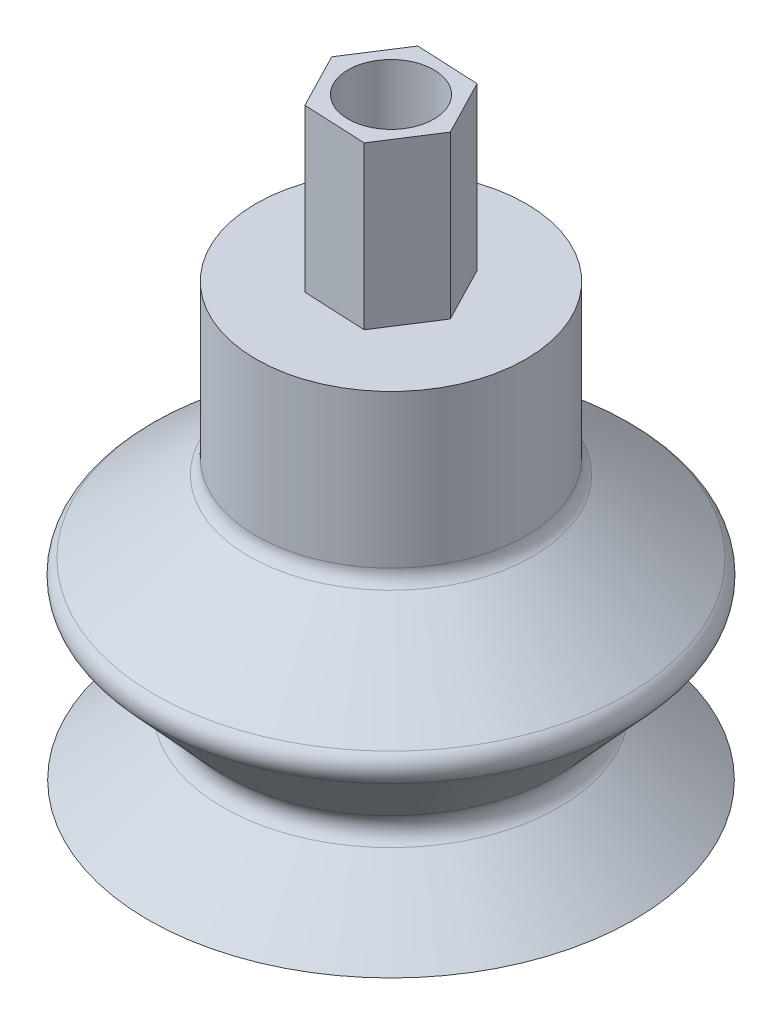
ISO-10303-21;
HEADER;
FILE_DESCRIPTION(('STEP AP214'),'2;1');
FILE_NAME('part.step','',(''),(''),'','','');
FILE_SCHEMA(('AUTOMOTIVE_DESIGN { 1 0 10303 214 1 1 1 1 }'));
ENDSEC;
DATA;
#1=APPLICATION_CONTEXT('core data for automotive mechanical design processes');
#2=APPLICATION_PROTOCOL_DEFINITION('international standard','automotive_design',2000,#1);
#3=PRODUCT_CONTEXT('',#1,'mechanical');
#4=PRODUCT('Part','Part','',(#3));
#5=PRODUCT_RELATED_PRODUCT_CATEGORY('part','',(#4));
#6=PRODUCT_DEFINITION_FORMATION('','',#4);
#7=PRODUCT_DEFINITION_CONTEXT('part definition',#1,'design');
#8=PRODUCT_DEFINITION('design','',#6,#7);
#9=PRODUCT_DEFINITION_SHAPE('','',#8);
#10=(LENGTH_UNIT() NAMED_UNIT(*) SI_UNIT(.MILLI.,.METRE.));
#11=(NAMED_UNIT(*) PLANE_ANGLE_UNIT() SI_UNIT($,.RADIAN.));
#12=(NAMED_UNIT(*) SI_UNIT($,.STERADIAN.) SOLID_ANGLE_UNIT());
#13=UNCERTAINTY_MEASURE_WITH_UNIT(LENGTH_MEASURE(1.E-05),#10,'distance_accuracy_value','');
#14=(GEOMETRIC_REPRESENTATION_CONTEXT(3) GLOBAL_UNCERTAINTY_ASSIGNED_CONTEXT((#13)) GLOBAL_UNIT_ASSIGNED_CONTEXT((#10,
#11,#12)) REPRESENTATION_CONTEXT('',''));
#15=CARTESIAN_POINT('',(0.,0.,0.));
#16=DIRECTION('',(0.,0.,1.));
#17=DIRECTION('',(1.,0.,0.));
#18=AXIS2_PLACEMENT_3D('',#15,#16,#17);
#19=CARTESIAN_POINT('',(0.,33.,0.));
#20=DIRECTION('',(0.,1.,0.));
#21=DIRECTION('',(0.,0.,1.));
#22=AXIS2_PLACEMENT_3D('',#19,#20,#21);
#23=PLANE('',#22);
#24=CARTESIAN_POINT('',(0.,33.,0.));
#25=DIRECTION('',(0.,1.,0.));
#26=DIRECTION('',(0.,0.,1.));
#27=AXIS2_PLACEMENT_3D('',#24,#25,#26);
#28=CIRCLE('',#27,2.38125);
#29=CARTESIAN_POINT('',(0.,33.,2.38125));
#30=VERTEX_POINT('',#29);
#31=EDGE_CURVE('E136',#30,#30,#28,.T.);
#32=ORIENTED_EDGE('',*,*,#31,.F.);
#33=EDGE_LOOP('',(#32));
#34=FACE_BOUND('',#33,.T.);
#35=DIRECTION('',(0.458306437489919,0.,0.88879424466819));
#36=VECTOR('',#35,1.);
#37=CARTESIAN_POINT('',(-3.460192769173,33.,-0.164517476770354));
#38=LINE('',#37,#36);
#39=CARTESIAN_POINT('',(-3.460192769173,33.,-0.164517476770354));
#40=VERTEX_POINT('',#39);
#41=CARTESIAN_POINT('',(-1.87257269883614,33.,2.91435610170987));
#42=VERTEX_POINT('',#41);
#43=EDGE_CURVE('E112',#40,#42,#38,.T.);
#44=ORIENTED_EDGE('',*,*,#43,.T.);
#45=DIRECTION('',(0.998871613365014,0.,0.0474921047498806));
#46=VECTOR('',#45,1.);
#47=CARTESIAN_POINT('',(-1.87257269883614,33.,2.91435610170987));
#48=LINE('',#47,#46);
#49=CARTESIAN_POINT('',(1.58762007033686,33.,3.07887357848022));
#50=VERTEX_POINT('',#49);
#51=EDGE_CURVE('E126',#42,#50,#48,.T.);
#52=ORIENTED_EDGE('',*,*,#51,.T.);
#53=DIRECTION('',(0.540565175875095,0.,-0.84130213991831));
#54=VECTOR('',#53,1.);
#55=CARTESIAN_POINT('',(1.58762007033686,33.,3.07887357848022));
#56=LINE('',#55,#54);
#57=CARTESIAN_POINT('',(3.460192769173,33.,0.164517476770354));
#58=VERTEX_POINT('',#57);
#59=EDGE_CURVE('E96',#50,#58,#56,.T.);
#60=ORIENTED_EDGE('',*,*,#59,.T.);
#61=DIRECTION('',(-0.458306437489919,0.,-0.88879424466819));
#62=VECTOR('',#61,1.);
#63=CARTESIAN_POINT('',(3.460192769173,33.,0.164517476770354));
#64=LINE('',#63,#62);
#65=CARTESIAN_POINT('',(1.87257269883614,33.,-2.91435610170987));
#66=VERTEX_POINT('',#65);
#67=EDGE_CURVE('E52',#58,#66,#64,.T.);
#68=ORIENTED_EDGE('',*,*,#67,.T.);
#69=DIRECTION('',(-0.998871613365014,0.,-0.0474921047498808));
#70=VECTOR('',#69,1.);
#71=CARTESIAN_POINT('',(1.87257269883614,33.,-2.91435610170987));
#72=LINE('',#71,#70);
#73=CARTESIAN_POINT('',(-1.58762007033686,33.,-3.07887357848022));
#74=VERTEX_POINT('',#73);
#75=EDGE_CURVE('E130',#66,#74,#72,.T.);
#76=ORIENTED_EDGE('',*,*,#75,.T.);
#77=DIRECTION('',(-0.540565175875096,0.,0.84130213991831));
#78=VECTOR('',#77,1.);
#79=CARTESIAN_POINT('',(-1.58762007033686,33.,-3.07887357848022));
#80=LINE('',#79,#78);
#81=EDGE_CURVE('E115',#74,#40,#80,.T.);
#82=ORIENTED_EDGE('',*,*,#81,.T.);
#83=EDGE_LOOP('',(#44,#52,#60,#68,#76,#82));
#84=FACE_BOUND('',#83,.T.);
#85=ADVANCED_FACE('F37',(#34,#84),#23,.T.);
#86=CARTESIAN_POINT('',(7.5,24.,0.));
#87=DIRECTION('',(0.,-1.,0.));
#88=DIRECTION('',(1.,0.,0.));
#89=AXIS2_PLACEMENT_3D('',#86,#87,#88);
#90=PLANE('',#89);
#91=CARTESIAN_POINT('',(0.,24.,0.));
#92=DIRECTION('',(0.,1.,0.));
#93=DIRECTION('',(-1.,0.,0.));
#94=AXIS2_PLACEMENT_3D('',#91,#92,#93);
#95=CIRCLE('',#94,7.5);
#96=CARTESIAN_POINT('',(-7.5,24.,0.));
#97=VERTEX_POINT('',#96);
#98=EDGE_CURVE('E164',#97,#97,#95,.T.);
#99=ORIENTED_EDGE('',*,*,#98,.T.);
#100=EDGE_LOOP('',(#99));
#101=FACE_BOUND('',#100,.T.);
#102=DIRECTION('',(0.458306437489919,0.,0.88879424466819));
#103=VECTOR('',#102,1.);
#104=CARTESIAN_POINT('',(-3.460192769173,24.,-0.164517476770354));
#105=LINE('',#104,#103);
#106=CARTESIAN_POINT('',(-3.460192769173,24.,-0.164517476770354));
#107=VERTEX_POINT('',#106);
#108=CARTESIAN_POINT('',(-1.87257269883614,24.,2.91435610170987));
#109=VERTEX_POINT('',#108);
#110=EDGE_CURVE('E102',#107,#109,#105,.T.);
#111=ORIENTED_EDGE('',*,*,#110,.F.);
#112=DIRECTION('',(-0.540565175875096,0.,0.84130213991831));
#113=VECTOR('',#112,1.);
#114=CARTESIAN_POINT('',(-1.58762007033686,24.,-3.07887357848022));
#115=LINE('',#114,#113);
#116=CARTESIAN_POINT('',(-1.58762007033686,24.,-3.07887357848022));
#117=VERTEX_POINT('',#116);
#118=EDGE_CURVE('E122',#117,#107,#115,.T.);
#119=ORIENTED_EDGE('',*,*,#118,.F.);
#120=DIRECTION('',(-0.998871613365014,0.,-0.0474921047498808));
#121=VECTOR('',#120,1.);
#122=CARTESIAN_POINT('',(1.87257269883614,24.,-2.91435610170987));
#123=LINE('',#122,#121);
#124=CARTESIAN_POINT('',(1.87257269883614,24.,-2.91435610170987));
#125=VERTEX_POINT('',#124);
#126=EDGE_CURVE('E119',#125,#117,#123,.T.);
#127=ORIENTED_EDGE('',*,*,#126,.F.);
#128=DIRECTION('',(-0.458306437489919,0.,-0.88879424466819));
#129=VECTOR('',#128,1.);
#130=CARTESIAN_POINT('',(3.460192769173,24.,0.164517476770354));
#131=LINE('',#130,#129);
#132=CARTESIAN_POINT('',(3.460192769173,24.,0.164517476770354));
#133=VERTEX_POINT('',#132);
#134=EDGE_CURVE('E60',#133,#125,#131,.T.);
#135=ORIENTED_EDGE('',*,*,#134,.F.);
#136=DIRECTION('',(0.540565175875095,0.,-0.84130213991831));
#137=VECTOR('',#136,1.);
#138=CARTESIAN_POINT('',(1.58762007033686,24.,3.07887357848022));
#139=LINE('',#138,#137);
#140=CARTESIAN_POINT('',(1.58762007033686,24.,3.07887357848022));
#141=VERTEX_POINT('',#140);
#142=EDGE_CURVE('E94',#141,#133,#139,.T.);
#143=ORIENTED_EDGE('',*,*,#142,.F.);
#144=DIRECTION('',(0.998871613365014,0.,0.0474921047498806));
#145=VECTOR('',#144,1.);
#146=CARTESIAN_POINT('',(-1.87257269883614,24.,2.91435610170987));
#147=LINE('',#146,#145);
#148=EDGE_CURVE('E107',#109,#141,#147,.T.);
#149=ORIENTED_EDGE('',*,*,#148,.F.);
#150=EDGE_LOOP('',(#111,#119,#127,#135,#143,#149));
#151=FACE_BOUND('',#150,.T.);
#152=ADVANCED_FACE('F106',(#101,#151),#90,.F.);
#153=CARTESIAN_POINT('',(0.,0.,0.));
#154=DIRECTION('',(0.,1.,0.));
#155=DIRECTION('',(-1.,0.,0.));
#156=AXIS2_PLACEMENT_3D('',#153,#154,#155);
#157=PLANE('',#156);
#158=CARTESIAN_POINT('',(0.,0.,0.));
#159=DIRECTION('',(0.,1.,0.));
#160=DIRECTION('',(-1.,0.,0.));
#161=AXIS2_PLACEMENT_3D('',#158,#159,#160);
#162=CIRCLE('',#161,12.0592970465776);
#163=CARTESIAN_POINT('',(-12.0592970465776,0.,0.));
#164=VERTEX_POINT('',#163);
#165=EDGE_CURVE('E153',#164,#164,#162,.T.);
#166=ORIENTED_EDGE('',*,*,#165,.T.);
#167=EDGE_LOOP('',(#166));
#168=FACE_BOUND('',#167,.T.);
#169=CARTESIAN_POINT('',(0.,0.,0.));
#170=DIRECTION('',(0.,1.,0.));
#171=DIRECTION('',(-1.,0.,0.));
#172=AXIS2_PLACEMENT_3D('',#169,#170,#171);
#173=CIRCLE('',#172,13.5);
#174=CARTESIAN_POINT('',(-13.5,0.,0.));
#175=VERTEX_POINT('',#174);
#176=EDGE_CURVE('E167',#175,#175,#173,.T.);
#177=ORIENTED_EDGE('',*,*,#176,.F.);
#178=EDGE_LOOP('',(#177));
#179=FACE_BOUND('',#178,.T.);
#180=ADVANCED_FACE('F215',(#168,#179),#157,.F.);
#181=CARTESIAN_POINT('',(0.,0.,0.));
#182=DIRECTION('',(0.,-1.,0.));
#183=DIRECTION('',(1.,0.,0.));
#184=AXIS2_PLACEMENT_3D('',#181,#182,#183);
#185=CONICAL_SURFACE('',#184,13.5,0.896055384571344);
#186=CARTESIAN_POINT('',(0.,3.33184473348769,0.));
#187=DIRECTION('',(0.,-1.,0.));
#188=DIRECTION('',(1.,0.,0.));
#189=AXIS2_PLACEMENT_3D('',#186,#187,#188);
#190=CIRCLE('',#189,9.33519408314038);
#191=CARTESIAN_POINT('',(9.33519408314038,3.3318447334877,0.));
#192=VERTEX_POINT('',#191);
#193=EDGE_CURVE('E11',#192,#192,#190,.T.);
#194=ORIENTED_EDGE('',*,*,#193,.T.);
#195=EDGE_LOOP('',(#194));
#196=FACE_BOUND('',#195,.T.);
#197=ORIENTED_EDGE('',*,*,#176,.T.);
#198=EDGE_LOOP('',(#197));
#199=FACE_BOUND('',#198,.T.);
#200=ADVANCED_FACE('F205',(#196,#199),#185,.T.);
#201=CARTESIAN_POINT('',(0.,4.,0.));
#202=DIRECTION('',(0.,1.,0.));
#203=DIRECTION('',(-1.,0.,0.));
#204=AXIS2_PLACEMENT_3D('',#201,#202,#203);
#205=CONICAL_SURFACE('',#204,8.5,0.741947268005917);
#206=CARTESIAN_POINT('',(0.,9.19635647057557,0.));
#207=DIRECTION('',(0.,-1.,0.));
#208=DIRECTION('',(1.,0.,0.));
#209=AXIS2_PLACEMENT_3D('',#206,#207,#208);
#210=CIRCLE('',#209,13.2633267646943);
#211=CARTESIAN_POINT('',(13.2633267646943,9.19635647057557,0.));
#212=VERTEX_POINT('',#211);
#213=EDGE_CURVE('E45',#212,#212,#210,.T.);
#214=ORIENTED_EDGE('',*,*,#213,.T.);
#215=EDGE_LOOP('',(#214));
#216=FACE_BOUND('',#215,.T.);
#217=CARTESIAN_POINT('',(0.,4.78843817144807,0.));
#218=DIRECTION('',(0.,1.,0.));
#219=DIRECTION('',(-1.,0.,0.));
#220=AXIS2_PLACEMENT_3D('',#217,#218,#219);
#221=CIRCLE('',#220,9.22273499049407);
#222=CARTESIAN_POINT('',(-9.22273499049407,4.78843817144807,0.));
#223=VERTEX_POINT('',#222);
#224=EDGE_CURVE('E179',#223,#223,#221,.T.);
#225=ORIENTED_EDGE('',*,*,#224,.T.);
#226=EDGE_LOOP('',(#225));
#227=FACE_BOUND('',#226,.T.);
#228=ADVANCED_FACE('F184',(#216,#227),#205,.T.);
#229=CARTESIAN_POINT('',(0.,10.,0.));
#230=DIRECTION('',(0.,-1.,0.));
#231=DIRECTION('',(1.,0.,0.));
#232=AXIS2_PLACEMENT_3D('',#229,#230,#231);
#233=CONICAL_SURFACE('',#232,14.,0.91510070055336);
#234=CARTESIAN_POINT('',(0.,14.6997775083459,0.));
#235=DIRECTION('',(0.,-1.,0.));
#236=DIRECTION('',(1.,0.,0.));
#237=AXIS2_PLACEMENT_3D('',#234,#235,#236);
#238=CIRCLE('',#237,7.8902892391503);
#239=CARTESIAN_POINT('',(7.8902892391503,14.6997775083459,0.));
#240=VERTEX_POINT('',#239);
#241=EDGE_CURVE('E176',#240,#240,#238,.T.);
#242=ORIENTED_EDGE('',*,*,#241,.T.);
#243=EDGE_LOOP('',(#242));
#244=FACE_BOUND('',#243,.T.);
#245=CARTESIAN_POINT('',(0.,10.6647050881975,0.));
#246=DIRECTION('',(0.,1.,0.));
#247=DIRECTION('',(-1.,0.,0.));
#248=AXIS2_PLACEMENT_3D('',#245,#246,#247);
#249=CIRCLE('',#248,13.1358833853432);
#250=CARTESIAN_POINT('',(-13.1358833853432,10.6647050881975,0.));
#251=VERTEX_POINT('',#250);
#252=EDGE_CURVE('E173',#251,#251,#249,.T.);
#253=ORIENTED_EDGE('',*,*,#252,.T.);
#254=EDGE_LOOP('',(#253));
#255=FACE_BOUND('',#254,.T.);
#256=ADVANCED_FACE('F193',(#244,#255),#233,.T.);
#257=CARTESIAN_POINT('',(0.,24.,0.));
#258=DIRECTION('',(0.,1.,0.));
#259=DIRECTION('',(-1.,0.,0.));
#260=AXIS2_PLACEMENT_3D('',#257,#258,#259);
#261=CYLINDRICAL_SURFACE('',#260,7.5);
#262=CARTESIAN_POINT('',(0.,15.4924014974505,0.));
#263=DIRECTION('',(0.,1.,0.));
#264=DIRECTION('',(-1.,0.,0.));
#265=AXIS2_PLACEMENT_3D('',#262,#263,#264);
#266=CIRCLE('',#265,7.5);
#267=CARTESIAN_POINT('',(-7.5,15.4924014974505,0.));
#268=VERTEX_POINT('',#267);
#269=EDGE_CURVE('E170',#268,#268,#266,.T.);
#270=ORIENTED_EDGE('',*,*,#269,.T.);
#271=EDGE_LOOP('',(#270));
#272=FACE_BOUND('',#271,.T.);
#273=ORIENTED_EDGE('',*,*,#98,.F.);
#274=EDGE_LOOP('',(#273));
#275=FACE_BOUND('',#274,.T.);
#276=ADVANCED_FACE('F195',(#272,#275),#261,.T.);
#277=CARTESIAN_POINT('',(0.,-0.702781928498727,0.));
#278=DIRECTION('',(0.,-1.,0.));
#279=DIRECTION('',(1.,0.,0.));
#280=AXIS2_PLACEMENT_3D('',#277,#278,#279);
#281=CONICAL_SURFACE('',#280,12.937774457201,0.896055384571344);
#282=CARTESIAN_POINT('',(0.,3.89855781136235,0.));
#283=DIRECTION('',(0.,1.,0.));
#284=DIRECTION('',(-1.,0.,0.));
#285=AXIS2_PLACEMENT_3D('',#282,#283,#284);
#286=CIRCLE('',#285,7.18609978237468);
#287=CARTESIAN_POINT('',(-7.18609978237468,3.89855781136235,0.));
#288=VERTEX_POINT('',#287);
#289=EDGE_CURVE('E150',#288,#288,#286,.T.);
#290=ORIENTED_EDGE('',*,*,#289,.T.);
#291=EDGE_LOOP('',(#290));
#292=FACE_BOUND('',#291,.T.);
#293=ORIENTED_EDGE('',*,*,#165,.F.);
#294=EDGE_LOOP('',(#293));
#295=FACE_BOUND('',#294,.T.);
#296=ADVANCED_FACE('F202',(#292,#295),#281,.F.);
#297=CARTESIAN_POINT('',(0.,4.60815216566561,0.));
#298=DIRECTION('',(0.,1.,0.));
#299=DIRECTION('',(-1.,0.,0.));
#300=AXIS2_PLACEMENT_3D('',#297,#298,#299);
#301=CONICAL_SURFACE('',#300,7.83656127381933,0.741947268005917);
#302=CARTESIAN_POINT('',(0.,9.88487298918363,0.));
#303=DIRECTION('',(0.,1.,0.));
#304=DIRECTION('',(-1.,0.,0.));
#305=AXIS2_PLACEMENT_3D('',#302,#303,#304);
#306=CIRCLE('',#305,12.6735553620442);
#307=CARTESIAN_POINT('',(-12.6735553620442,9.88487298918363,0.));
#308=VERTEX_POINT('',#307);
#309=EDGE_CURVE('E154',#308,#308,#306,.T.);
#310=ORIENTED_EDGE('',*,*,#309,.T.);
#311=EDGE_LOOP('',(#310));
#312=FACE_BOUND('',#311,.T.);
#313=ORIENTED_EDGE('',*,*,#289,.F.);
#314=EDGE_LOOP('',(#313));
#315=FACE_BOUND('',#314,.T.);
#316=ADVANCED_FACE('F226',(#312,#315),#301,.F.);
#317=CARTESIAN_POINT('',(0.,9.28663840980586,0.));
#318=DIRECTION('',(0.,-1.,0.));
#319=DIRECTION('',(1.,0.,0.));
#320=AXIS2_PLACEMENT_3D('',#317,#318,#319);
#321=CONICAL_SURFACE('',#320,13.4512603152353,0.91510070055336);
#322=CARTESIAN_POINT('',(0.,14.5568386522945,0.));
#323=DIRECTION('',(0.,-1.,0.));
#324=DIRECTION('',(1.,0.,0.));
#325=AXIS2_PLACEMENT_3D('',#322,#323,#324);
#326=CIRCLE('',#325,6.6);
#327=CARTESIAN_POINT('',(6.6,14.5568386522945,0.));
#328=VERTEX_POINT('',#327);
#329=EDGE_CURVE('E157',#328,#328,#326,.F.);
#330=ORIENTED_EDGE('',*,*,#329,.T.);
#331=EDGE_LOOP('',(#330));
#332=FACE_BOUND('',#331,.T.);
#333=ORIENTED_EDGE('',*,*,#309,.F.);
#334=EDGE_LOOP('',(#333));
#335=FACE_BOUND('',#334,.T.);
#336=ADVANCED_FACE('F230',(#332,#335),#321,.F.);
#337=CARTESIAN_POINT('',(0.,24.,0.));
#338=DIRECTION('',(0.,1.,0.));
#339=DIRECTION('',(-1.,0.,0.));
#340=AXIS2_PLACEMENT_3D('',#337,#338,#339);
#341=CYLINDRICAL_SURFACE('',#340,6.6);
#342=CARTESIAN_POINT('',(0.,23.1,0.));
#343=DIRECTION('',(0.,-1.,0.));
#344=DIRECTION('',(1.,0.,0.));
#345=AXIS2_PLACEMENT_3D('',#342,#343,#344);
#346=CIRCLE('',#345,6.6);
#347=CARTESIAN_POINT('',(6.6,23.1,0.));
#348=VERTEX_POINT('',#347);
#349=EDGE_CURVE('E149',#348,#348,#346,.F.);
#350=ORIENTED_EDGE('',*,*,#349,.T.);
#351=EDGE_LOOP('',(#350));
#352=FACE_BOUND('',#351,.T.);
#353=ORIENTED_EDGE('',*,*,#329,.F.);
#354=EDGE_LOOP('',(#353));
#355=FACE_BOUND('',#354,.T.);
#356=ADVANCED_FACE('F234',(#352,#355),#341,.F.);
#357=CARTESIAN_POINT('',(7.5,23.1,0.));
#358=DIRECTION('',(0.,-1.,0.));
#359=DIRECTION('',(1.,0.,0.));
#360=AXIS2_PLACEMENT_3D('',#357,#358,#359);
#361=PLANE('',#360);
#362=CARTESIAN_POINT('',(0.,23.1,0.));
#363=DIRECTION('',(0.,-1.,0.));
#364=DIRECTION('',(1.,0.,0.));
#365=AXIS2_PLACEMENT_3D('',#362,#363,#364);
#366=CIRCLE('',#365,2.38125);
#367=CARTESIAN_POINT('',(2.38125,23.1,0.));
#368=VERTEX_POINT('',#367);
#369=EDGE_CURVE('E146',#368,#368,#366,.T.);
#370=ORIENTED_EDGE('',*,*,#369,.F.);
#371=EDGE_LOOP('',(#370));
#372=FACE_BOUND('',#371,.T.);
#373=ORIENTED_EDGE('',*,*,#349,.F.);
#374=EDGE_LOOP('',(#373));
#375=FACE_BOUND('',#374,.T.);
#376=ADVANCED_FACE('F238',(#372,#375),#361,.T.);
#377=CARTESIAN_POINT('',(0.,15.4924014974505,0.));
#378=DIRECTION('',(0.,1.,0.));
#379=DIRECTION('',(-1.,0.,0.));
#380=AXIS2_PLACEMENT_3D('',#377,#378,#379);
#381=TOROIDAL_SURFACE('',#380,8.5,1.);
#382=ORIENTED_EDGE('',*,*,#241,.F.);
#383=EDGE_LOOP('',(#382));
#384=FACE_BOUND('',#383,.T.);
#385=ORIENTED_EDGE('',*,*,#269,.F.);
#386=EDGE_LOOP('',(#385));
#387=FACE_BOUND('',#386,.T.);
#388=ADVANCED_FACE('F190',(#384,#387),#381,.F.);
#389=CARTESIAN_POINT('',(0.,9.87208109909292,0.));
#390=DIRECTION('',(0.,-1.,0.));
#391=DIRECTION('',(1.,0.,0.));
#392=AXIS2_PLACEMENT_3D('',#389,#390,#391);
#393=TOROIDAL_SURFACE('',#392,12.5261726244935,1.);
#394=ORIENTED_EDGE('',*,*,#213,.F.);
#395=EDGE_LOOP('',(#394));
#396=FACE_BOUND('',#395,.T.);
#397=ORIENTED_EDGE('',*,*,#252,.F.);
#398=EDGE_LOOP('',(#397));
#399=FACE_BOUND('',#398,.T.);
#400=ADVANCED_FACE('F187',(#396,#399),#393,.T.);
#401=CARTESIAN_POINT('',(0.,4.11271354293073,0.));
#402=DIRECTION('',(0.,1.,0.));
#403=DIRECTION('',(-1.,0.,0.));
#404=AXIS2_PLACEMENT_3D('',#401,#402,#403);
#405=TOROIDAL_SURFACE('',#404,9.95988913069481,1.);
#406=ORIENTED_EDGE('',*,*,#193,.F.);
#407=EDGE_LOOP('',(#406));
#408=FACE_BOUND('',#407,.T.);
#409=ORIENTED_EDGE('',*,*,#224,.F.);
#410=EDGE_LOOP('',(#409));
#411=FACE_BOUND('',#410,.T.);
#412=ADVANCED_FACE('F39',(#408,#411),#405,.F.);
#413=CARTESIAN_POINT('',(0.,0.,0.));
#414=DIRECTION('',(0.,1.,0.));
#415=DIRECTION('',(0.,0.,1.));
#416=AXIS2_PLACEMENT_3D('',#413,#414,#415);
#417=CYLINDRICAL_SURFACE('',#416,2.38125);
#418=ORIENTED_EDGE('',*,*,#369,.T.);
#419=EDGE_LOOP('',(#418));
#420=FACE_BOUND('',#419,.T.);
#421=ORIENTED_EDGE('',*,*,#31,.T.);
#422=EDGE_LOOP('',(#421));
#423=FACE_BOUND('',#422,.T.);
#424=ADVANCED_FACE('F222',(#420,#423),#417,.F.);
#425=CARTESIAN_POINT('',(-1.87257269883614,24.,2.91435610170987));
#426=DIRECTION('',(-0.0474921047498806,0.,0.998871613365014));
#427=DIRECTION('',(0.998871613365014,0.,0.0474921047498806));
#428=AXIS2_PLACEMENT_3D('',#425,#426,#427);
#429=PLANE('',#428);
#430=ORIENTED_EDGE('',*,*,#51,.F.);
#431=DIRECTION('',(0.,1.,0.));
#432=VECTOR('',#431,1.);
#433=CARTESIAN_POINT('',(-1.87257269883614,24.,2.91435610170987));
#434=LINE('',#433,#432);
#435=EDGE_CURVE('E111',#109,#42,#434,.T.);
#436=ORIENTED_EDGE('',*,*,#435,.F.);
#437=ORIENTED_EDGE('',*,*,#148,.T.);
#438=DIRECTION('',(0.,1.,0.));
#439=VECTOR('',#438,1.);
#440=CARTESIAN_POINT('',(1.58762007033686,24.,3.07887357848022));
#441=LINE('',#440,#439);
#442=EDGE_CURVE('E92',#141,#50,#441,.T.);
#443=ORIENTED_EDGE('',*,*,#442,.T.);
#444=EDGE_LOOP('',(#430,#436,#437,#443));
#445=FACE_BOUND('',#444,.T.);
#446=ADVANCED_FACE('F110',(#445),#429,.T.);
#447=CARTESIAN_POINT('',(-3.460192769173,24.,-0.164517476770354));
#448=DIRECTION('',(-0.88879424466819,0.,0.458306437489919));
#449=DIRECTION('',(0.458306437489919,0.,0.88879424466819));
#450=AXIS2_PLACEMENT_3D('',#447,#448,#449);
#451=PLANE('',#450);
#452=ORIENTED_EDGE('',*,*,#43,.F.);
#453=DIRECTION('',(0.,1.,0.));
#454=VECTOR('',#453,1.);
#455=CARTESIAN_POINT('',(-3.460192769173,24.,-0.164517476770354));
#456=LINE('',#455,#454);
#457=EDGE_CURVE('E137',#107,#40,#456,.T.);
#458=ORIENTED_EDGE('',*,*,#457,.F.);
#459=ORIENTED_EDGE('',*,*,#110,.T.);
#460=ORIENTED_EDGE('',*,*,#435,.T.);
#461=EDGE_LOOP('',(#452,#458,#459,#460));
#462=FACE_BOUND('',#461,.T.);
#463=ADVANCED_FACE('F281',(#462),#451,.T.);
#464=CARTESIAN_POINT('',(-1.58762007033686,24.,-3.07887357848022));
#465=DIRECTION('',(-0.841302139918309,0.,-0.540565175875095));
#466=DIRECTION('',(-0.540565175875096,0.,0.84130213991831));
#467=AXIS2_PLACEMENT_3D('',#464,#465,#466);
#468=PLANE('',#467);
#469=ORIENTED_EDGE('',*,*,#81,.F.);
#470=DIRECTION('',(0.,1.,0.));
#471=VECTOR('',#470,1.);
#472=CARTESIAN_POINT('',(-1.58762007033686,24.,-3.07887357848022));
#473=LINE('',#472,#471);
#474=EDGE_CURVE('E139',#117,#74,#473,.T.);
#475=ORIENTED_EDGE('',*,*,#474,.F.);
#476=ORIENTED_EDGE('',*,*,#118,.T.);
#477=ORIENTED_EDGE('',*,*,#457,.T.);
#478=EDGE_LOOP('',(#469,#475,#476,#477));
#479=FACE_BOUND('',#478,.T.);
#480=ADVANCED_FACE('F286',(#479),#468,.T.);
#481=CARTESIAN_POINT('',(1.87257269883614,24.,-2.91435610170987));
#482=DIRECTION('',(0.0474921047498808,0.,-0.998871613365014));
#483=DIRECTION('',(-0.998871613365014,0.,-0.0474921047498808));
#484=AXIS2_PLACEMENT_3D('',#481,#482,#483);
#485=PLANE('',#484);
#486=ORIENTED_EDGE('',*,*,#75,.F.);
#487=DIRECTION('',(0.,1.,0.));
#488=VECTOR('',#487,1.);
#489=CARTESIAN_POINT('',(1.87257269883614,24.,-2.91435610170987));
#490=LINE('',#489,#488);
#491=EDGE_CURVE('E141',#125,#66,#490,.T.);
#492=ORIENTED_EDGE('',*,*,#491,.F.);
#493=ORIENTED_EDGE('',*,*,#126,.T.);
#494=ORIENTED_EDGE('',*,*,#474,.T.);
#495=EDGE_LOOP('',(#486,#492,#493,#494));
#496=FACE_BOUND('',#495,.T.);
#497=ADVANCED_FACE('F295',(#496),#485,.T.);
#498=CARTESIAN_POINT('',(3.460192769173,24.,0.164517476770354));
#499=DIRECTION('',(0.888794244668191,0.,-0.458306437489919));
#500=DIRECTION('',(-0.458306437489919,0.,-0.888794244668191));
#501=AXIS2_PLACEMENT_3D('',#498,#499,#500);
#502=PLANE('',#501);
#503=ORIENTED_EDGE('',*,*,#67,.F.);
#504=DIRECTION('',(0.,1.,0.));
#505=VECTOR('',#504,1.);
#506=CARTESIAN_POINT('',(3.460192769173,24.,0.164517476770354));
#507=LINE('',#506,#505);
#508=EDGE_CURVE('E101',#133,#58,#507,.T.);
#509=ORIENTED_EDGE('',*,*,#508,.F.);
#510=ORIENTED_EDGE('',*,*,#134,.T.);
#511=ORIENTED_EDGE('',*,*,#491,.T.);
#512=EDGE_LOOP('',(#503,#509,#510,#511));
#513=FACE_BOUND('',#512,.T.);
#514=ADVANCED_FACE('F292',(#513),#502,.T.);
#515=CARTESIAN_POINT('',(1.58762007033686,24.,3.07887357848022));
#516=DIRECTION('',(0.84130213991831,0.,0.540565175875095));
#517=DIRECTION('',(0.540565175875095,0.,-0.84130213991831));
#518=AXIS2_PLACEMENT_3D('',#515,#516,#517);
#519=PLANE('',#518);
#520=ORIENTED_EDGE('',*,*,#59,.F.);
#521=ORIENTED_EDGE('',*,*,#442,.F.);
#522=ORIENTED_EDGE('',*,*,#142,.T.);
#523=ORIENTED_EDGE('',*,*,#508,.T.);
#524=EDGE_LOOP('',(#520,#521,#522,#523));
#525=FACE_BOUND('',#524,.T.);
#526=ADVANCED_FACE('F93',(#525),#519,.T.);
#527=CLOSED_SHELL('',(#85,#152,#180,#200,#228,#256,#276,#296,#316,#336,#356,#376,#388,#400,#412,
#424,#446,#463,#480,#497,#514,#526));
#528=MANIFOLD_SOLID_BREP('B2',#527);
#529=ADVANCED_BREP_SHAPE_REPRESENTATION('',(#18,#528),#14);
#530=SHAPE_DEFINITION_REPRESENTATION(#9,#529);
ENDSEC;
END-ISO-10303-21;
